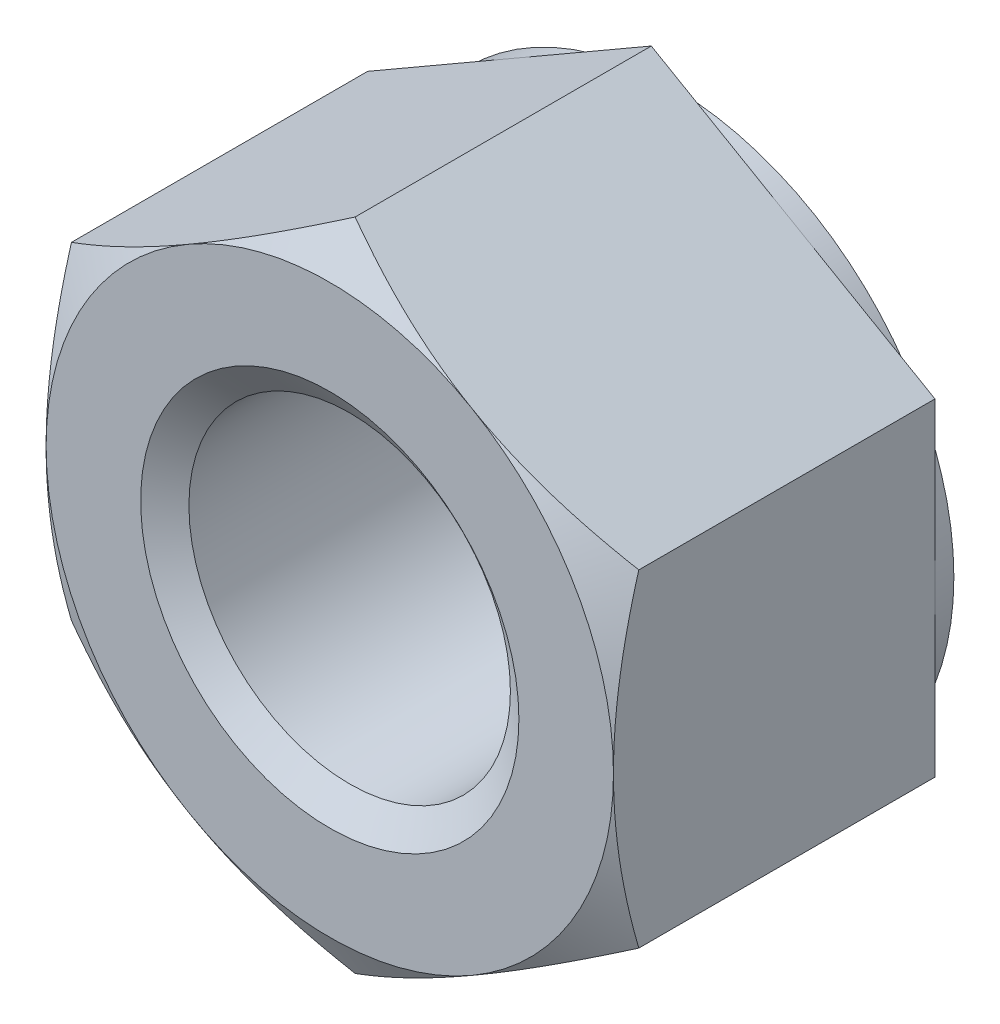
ISO-10303-21;
HEADER;
FILE_DESCRIPTION(('STEP AP214'),'2;1');
FILE_NAME('part.step','',(''),(''),'','','');
FILE_SCHEMA(('AUTOMOTIVE_DESIGN { 1 0 10303 214 1 1 1 1 }'));
ENDSEC;
DATA;
#1=APPLICATION_CONTEXT('core data for automotive mechanical design processes');
#2=APPLICATION_PROTOCOL_DEFINITION('international standard','automotive_design',2000,#1);
#3=PRODUCT_CONTEXT('',#1,'mechanical');
#4=PRODUCT('Part','Part','',(#3));
#5=PRODUCT_RELATED_PRODUCT_CATEGORY('part','',(#4));
#6=PRODUCT_DEFINITION_FORMATION('','',#4);
#7=PRODUCT_DEFINITION_CONTEXT('part definition',#1,'design');
#8=PRODUCT_DEFINITION('design','',#6,#7);
#9=PRODUCT_DEFINITION_SHAPE('','',#8);
#10=(LENGTH_UNIT() NAMED_UNIT(*) SI_UNIT(.MILLI.,.METRE.));
#11=(NAMED_UNIT(*) PLANE_ANGLE_UNIT() SI_UNIT($,.RADIAN.));
#12=(NAMED_UNIT(*) SI_UNIT($,.STERADIAN.) SOLID_ANGLE_UNIT());
#13=UNCERTAINTY_MEASURE_WITH_UNIT(LENGTH_MEASURE(1.E-05),#10,'distance_accuracy_value','');
#14=(GEOMETRIC_REPRESENTATION_CONTEXT(3) GLOBAL_UNCERTAINTY_ASSIGNED_CONTEXT((#13)) GLOBAL_UNIT_ASSIGNED_CONTEXT((#10,
#11,#12)) REPRESENTATION_CONTEXT('',''));
#15=CARTESIAN_POINT('',(0.,0.,0.));
#16=DIRECTION('',(0.,0.,1.));
#17=DIRECTION('',(1.,0.,0.));
#18=AXIS2_PLACEMENT_3D('',#15,#16,#17);
#19=CARTESIAN_POINT('',(0.,0.,-10.8));
#20=DIRECTION('',(0.,0.,1.));
#21=DIRECTION('',(1.,0.,0.));
#22=AXIS2_PLACEMENT_3D('',#19,#20,#21);
#23=CYLINDRICAL_SURFACE('',#22,5.1);
#24=CARTESIAN_POINT('',(0.,0.,-0.630186784388741));
#25=DIRECTION('',(0.,0.,1.));
#26=DIRECTION('',(1.,0.,0.));
#27=AXIS2_PLACEMENT_3D('',#24,#25,#26);
#28=CIRCLE('',#27,5.1);
#29=CARTESIAN_POINT('',(5.1,0.,-0.630186784388741));
#30=VERTEX_POINT('',#29);
#31=EDGE_CURVE('E154',#30,#30,#28,.F.);
#32=CARTESIAN_POINT('',(0.,0.,-10.1444132156113));
#33=DIRECTION('',(0.,0.,-1.));
#34=DIRECTION('',(-1.,0.,0.));
#35=AXIS2_PLACEMENT_3D('',#32,#33,#34);
#36=CIRCLE('',#35,5.1);
#37=CARTESIAN_POINT('',(5.1,0.,-10.1444132156113));
#38=VERTEX_POINT('',#37);
#39=EDGE_CURVE('E42',#38,#38,#36,.F.);
#40=CARTESIAN_POINT('',(5.1,0.,-0.630186784388741));
#41=CARTESIAN_POINT('',(5.1,0.,-0.729293309713976));
#42=CARTESIAN_POINT('',(5.1,0.,-0.82839983503921));
#43=CARTESIAN_POINT('',(5.1,0.,-1.02661288568968));
#44=CARTESIAN_POINT('',(5.1,0.,-1.12571941101491));
#45=CARTESIAN_POINT('',(5.1,0.,-1.32393246166538));
#46=CARTESIAN_POINT('',(5.1,0.,-1.42303898699062));
#47=CARTESIAN_POINT('',(5.1,0.,-1.62125203764109));
#48=CARTESIAN_POINT('',(5.1,0.,-1.72035856296632));
#49=CARTESIAN_POINT('',(5.1,0.,-1.91857161361679));
#50=CARTESIAN_POINT('',(5.1,0.,-2.01767813894202));
#51=CARTESIAN_POINT('',(5.1,0.,-2.21589118959249));
#52=CARTESIAN_POINT('',(5.1,0.,-2.31499771491773));
#53=CARTESIAN_POINT('',(5.1,0.,-2.5132107655682));
#54=CARTESIAN_POINT('',(5.1,0.,-2.61231729089343));
#55=CARTESIAN_POINT('',(5.1,0.,-2.8105303415439));
#56=CARTESIAN_POINT('',(5.1,0.,-2.90963686686914));
#57=CARTESIAN_POINT('',(5.1,0.,-3.1078499175196));
#58=CARTESIAN_POINT('',(5.1,0.,-3.20695644284484));
#59=CARTESIAN_POINT('',(5.1,0.,-3.40516949349531));
#60=CARTESIAN_POINT('',(5.1,0.,-3.50427601882054));
#61=CARTESIAN_POINT('',(5.1,0.,-3.70248906947101));
#62=CARTESIAN_POINT('',(5.1,0.,-3.80159559479625));
#63=CARTESIAN_POINT('',(5.1,0.,-3.99980864544671));
#64=CARTESIAN_POINT('',(5.1,0.,-4.09891517077195));
#65=CARTESIAN_POINT('',(5.1,0.,-4.29712822142242));
#66=CARTESIAN_POINT('',(5.1,0.,-4.39623474674765));
#67=CARTESIAN_POINT('',(5.1,0.,-4.59444779739812));
#68=CARTESIAN_POINT('',(5.1,0.,-4.69355432272336));
#69=CARTESIAN_POINT('',(5.1,0.,-4.89176737337382));
#70=CARTESIAN_POINT('',(5.1,0.,-4.99087389869906));
#71=CARTESIAN_POINT('',(5.1,0.,-5.18908694934953));
#72=CARTESIAN_POINT('',(5.1,0.,-5.28819347467476));
#73=CARTESIAN_POINT('',(5.1,0.,-5.48640652532523));
#74=CARTESIAN_POINT('',(5.1,0.,-5.58551305065047));
#75=CARTESIAN_POINT('',(5.1,0.,-5.78372610130094));
#76=CARTESIAN_POINT('',(5.1,0.,-5.88283262662617));
#77=CARTESIAN_POINT('',(5.1,0.,-6.08104567727664));
#78=CARTESIAN_POINT('',(5.1,0.,-6.18015220260187));
#79=CARTESIAN_POINT('',(5.1,0.,-6.37836525325234));
#80=CARTESIAN_POINT('',(5.1,0.,-6.47747177857758));
#81=CARTESIAN_POINT('',(5.1,0.,-6.67568482922805));
#82=CARTESIAN_POINT('',(5.1,0.,-6.77479135455328));
#83=CARTESIAN_POINT('',(5.1,0.,-6.97300440520375));
#84=CARTESIAN_POINT('',(5.1,0.,-7.07211093052898));
#85=CARTESIAN_POINT('',(5.1,0.,-7.27032398117945));
#86=CARTESIAN_POINT('',(5.1,0.,-7.36943050650469));
#87=CARTESIAN_POINT('',(5.1,0.,-7.56764355715516));
#88=CARTESIAN_POINT('',(5.1,0.,-7.66675008248039));
#89=CARTESIAN_POINT('',(5.1,0.,-7.86496313313086));
#90=CARTESIAN_POINT('',(5.1,0.,-7.96406965845609));
#91=CARTESIAN_POINT('',(5.1,0.,-8.16228270910656));
#92=CARTESIAN_POINT('',(5.1,0.,-8.2613892344318));
#93=CARTESIAN_POINT('',(5.1,0.,-8.45960228508227));
#94=CARTESIAN_POINT('',(5.1,0.,-8.5587088104075));
#95=CARTESIAN_POINT('',(5.1,0.,-8.75692186105797));
#96=CARTESIAN_POINT('',(5.1,0.,-8.8560283863832));
#97=CARTESIAN_POINT('',(5.1,0.,-9.05424143703367));
#98=CARTESIAN_POINT('',(5.1,0.,-9.15334796235891));
#99=CARTESIAN_POINT('',(5.1,0.,-9.35156101300938));
#100=CARTESIAN_POINT('',(5.1,0.,-9.45066753833461));
#101=CARTESIAN_POINT('',(5.1,0.,-9.64888058898508));
#102=CARTESIAN_POINT('',(5.1,0.,-9.74798711431032));
#103=CARTESIAN_POINT('',(5.1,0.,-9.94620016496079));
#104=CARTESIAN_POINT('',(5.1,0.,-10.045306690286));
#105=CARTESIAN_POINT('',(5.1,0.,-10.1444132156113));
#106=B_SPLINE_CURVE_WITH_KNOTS('',3,(#40,#41,#42,#43,#44,#45,#46,#47,#48,#49,#50,#51,#52,#53,
#54,#55,#56,#57,#58,#59,#60,#61,#62,#63,#64,#65,#66,#67,#68,#69,#70,#71,#72,#73,#74,#75,#76,#77,
#78,#79,#80,#81,#82,#83,#84,#85,#86,#87,#88,#89,#90,#91,#92,#93,#94,#95,#96,#97,#98,#99,#100,
#101,#102,#103,#104,#105),.UNSPECIFIED.,.F.,.F.,(4,2,2,2,2,2,2,2,2,2,2,2,2,2,2,2,2,2,2,2,2,2,2,
2,2,2,2,2,2,2,2,2,4),(0.,0.297319575975704,0.594639151951407,0.891958727927111,1.18927830390281,
1.48659787987852,1.78391745585422,2.08123703182993,2.37855660780563,2.67587618378133,
2.97319575975704,3.27051533573274,3.56783491170844,3.86515448768415,4.16247406365985,
4.45979363963555,4.75711321561126,5.05443279158696,5.35175236756266,5.64907194353837,
5.94639151951407,6.24371109548977,6.54103067146548,6.83835024744118,7.13566982341688,
7.43298939939259,7.73030897536829,8.02762855134399,8.3249481273197,8.6222677032954,
8.91958727927111,9.21690685524681,9.51422643122251),.UNSPECIFIED.);
#107=EDGE_CURVE('BSEAM37',#30,#38,#106,.T.);
#108=ORIENTED_EDGE('',*,*,#31,.F.);
#109=ORIENTED_EDGE('',*,*,#39,.F.);
#110=ORIENTED_EDGE('',*,*,#107,.T.);
#111=ORIENTED_EDGE('',*,*,#107,.F.);
#112=EDGE_LOOP('',(#108,#110,#109,#111));
#113=FACE_BOUND('',#112,.T.);
#114=ADVANCED_FACE('F37',(#113),#23,.F.);
#115=CARTESIAN_POINT('',(0.,10.3923048454133,-10.8));
#116=DIRECTION('',(-0.5,0.866025403784439,0.));
#117=DIRECTION('',(-0.866025403784439,-0.5,0.));
#118=AXIS2_PLACEMENT_3D('',#115,#116,#117);
#119=PLANE('',#118);
#120=DIRECTION('',(0.,0.,1.));
#121=VECTOR('',#120,1.);
#122=CARTESIAN_POINT('',(-9.,5.19615242270663,-10.8));
#123=LINE('',#122,#121);
#124=CARTESIAN_POINT('',(-9.,5.19615242270663,-10.2));
#125=VERTEX_POINT('',#124);
#126=CARTESIAN_POINT('',(-9.,5.19615242270663,-0.803847577293374));
#127=VERTEX_POINT('',#126);
#128=EDGE_CURVE('E286',#125,#127,#123,.T.);
#129=ORIENTED_EDGE('',*,*,#128,.T.);
#130=CARTESIAN_POINT('',(-9.0002,5.19603695265279,-0.803914245071137));
#131=CARTESIAN_POINT('',(-8.80239295359878,5.31024090414014,-0.737982001874058));
#132=CARTESIAN_POINT('',(-8.60381439335005,5.42489028935503,-0.675041409210315));
#133=CARTESIAN_POINT('',(-8.20504463395579,5.65512011728599,-0.555968997655539));
#134=CARTESIAN_POINT('',(-8.00485277818155,5.77070093910682,-0.499840117752065));
#135=CARTESIAN_POINT('',(-7.6024849429039,6.00300811711762,-0.395151960728964));
#136=CARTESIAN_POINT('',(-7.4003054074994,6.11973652630804,-0.346610772912787));
#137=CARTESIAN_POINT('',(-6.99457124410925,6.35398725476077,-0.25814851678792));
#138=CARTESIAN_POINT('',(-6.79101690582109,6.47150940676616,-0.218225687483274));
#139=CARTESIAN_POINT('',(-6.38769409169308,6.70436794207328,-0.148684674147114));
#140=CARTESIAN_POINT('',(-6.18795540760099,6.81968712510143,-0.1188375028478));
#141=CARTESIAN_POINT('',(-5.787584324011,7.05084147798785,-0.0687933098590817));
#142=CARTESIAN_POINT('',(-5.58695200505839,7.16667660134328,-0.0485954355375392));
#143=CARTESIAN_POINT('',(-5.18533936402618,7.39854776775319,-0.0183543473973464));
#144=CARTESIAN_POINT('',(-4.98435969733606,7.51458343241837,-0.00829960958430289));
#145=CARTESIAN_POINT('',(-4.58221540008357,7.74676155069016,0.00143766485491798));
#146=CARTESIAN_POINT('',(-4.38105077542777,7.86290400088662,0.00112052193524444));
#147=CARTESIAN_POINT('',(-4.00496738746949,8.08003584616208,-0.00916395215317263));
#148=CARTESIAN_POINT('',(-3.83002210563971,8.18104055171996,-0.0178767400303967));
#149=CARTESIAN_POINT('',(-3.48054132291665,8.38281337570172,-0.0429773400653703));
#150=CARTESIAN_POINT('',(-3.30600585044303,8.48358147771751,-0.0593656695806704));
#151=CARTESIAN_POINT('',(-2.78307512271449,8.7854956741391,-0.119656556235832));
#152=CARTESIAN_POINT('',(-2.43560548489508,8.98610736306936,-0.17467748234113));
#153=CARTESIAN_POINT('',(-1.736980371246,9.38945876049729,-0.312230476325153));
#154=CARTESIAN_POINT('',(-1.38591405631283,9.59214699192737,-0.395345618627111));
#155=CARTESIAN_POINT('',(-0.689016695981394,9.99450087051226,-0.583982539436467));
#156=CARTESIAN_POINT('',(-0.343176726443721,10.1941716700214,-0.689460012893363));
#157=CARTESIAN_POINT('',(0.000199999999999849,10.3924203154671,-0.803914245071137));
#158=B_SPLINE_CURVE_WITH_KNOTS('',3,(#130,#131,#132,#133,#134,#135,#136,#137,#138,#139,#140,
#141,#142,#143,#144,#145,#146,#147,#148,#149,#150,#151,#152,#153,#154,#155,#156,#157),
.UNSPECIFIED.,.F.,.F.,(4,2,2,2,2,2,2,2,2,2,2,2,2,4),(0.,0.713219249102579,1.42674513853509,
2.14194697262263,2.85700253034481,3.55449749123034,4.25193080859215,4.94857085059646,
5.64518936892663,6.25162976378284,6.85811104066341,8.07193747617894,9.31268391793542,
10.5509947443908),.UNSPECIFIED.);
#159=CARTESIAN_POINT('',(-4.5,7.79422863405995,0.));
#160=VERTEX_POINT('',#159);
#161=EDGE_CURVE('E140',#127,#160,#158,.T.);
#162=ORIENTED_EDGE('',*,*,#161,.T.);
#163=CARTESIAN_POINT('',(0.,10.3923048454133,-0.803847577293371));
#164=VERTEX_POINT('',#163);
#165=EDGE_CURVE('E167',#160,#164,#158,.T.);
#166=ORIENTED_EDGE('',*,*,#165,.T.);
#167=DIRECTION('',(0.,0.,1.));
#168=VECTOR('',#167,1.);
#169=CARTESIAN_POINT('',(0.,10.3923048454133,-10.8));
#170=LINE('',#169,#168);
#171=CARTESIAN_POINT('',(0.,10.3923048454133,-10.2));
#172=VERTEX_POINT('',#171);
#173=EDGE_CURVE('E274',#172,#164,#170,.T.);
#174=ORIENTED_EDGE('',*,*,#173,.F.);
#175=DIRECTION('',(-0.866025403784439,-0.5,0.));
#176=VECTOR('',#175,1.);
#177=CARTESIAN_POINT('',(0.,10.3923048454133,-10.2));
#178=LINE('',#177,#176);
#179=CARTESIAN_POINT('',(-4.5,7.79422863405995,-10.2));
#180=VERTEX_POINT('',#179);
#181=EDGE_CURVE('E262',#172,#180,#178,.T.);
#182=ORIENTED_EDGE('',*,*,#181,.T.);
#183=EDGE_CURVE('E258',#180,#125,#178,.T.);
#184=ORIENTED_EDGE('',*,*,#183,.T.);
#185=EDGE_LOOP('',(#129,#162,#166,#174,#182,#184));
#186=FACE_BOUND('',#185,.T.);
#187=ADVANCED_FACE('F39',(#186),#119,.T.);
#188=CARTESIAN_POINT('',(9.,5.19615242270663,-10.8));
#189=DIRECTION('',(0.5,0.866025403784439,0.));
#190=DIRECTION('',(-0.866025403784439,0.5,0.));
#191=AXIS2_PLACEMENT_3D('',#188,#189,#190);
#192=PLANE('',#191);
#193=ORIENTED_EDGE('',*,*,#173,.T.);
#194=CARTESIAN_POINT('',(-0.000200000000000468,10.3924203154671,-0.803914245071137));
#195=CARTESIAN_POINT('',(0.197607046401216,10.2782163639798,-0.737982001874058));
#196=CARTESIAN_POINT('',(0.396185606649945,10.1635669787649,-0.675041409210316));
#197=CARTESIAN_POINT('',(0.79495536604421,9.9333371508339,-0.555968997655538));
#198=CARTESIAN_POINT('',(0.995147221818451,9.81775632901307,-0.499840117752064));
#199=CARTESIAN_POINT('',(1.3975150570961,9.58544915100228,-0.395151960728962));
#200=CARTESIAN_POINT('',(1.5996945925006,9.46872074181186,-0.346610772912786));
#201=CARTESIAN_POINT('',(2.00542875589075,9.23447001335912,-0.258148516787919));
#202=CARTESIAN_POINT('',(2.20898309417891,9.11694786135374,-0.218225687483273));
#203=CARTESIAN_POINT('',(2.61230590830692,8.88408932604661,-0.148684674147113));
#204=CARTESIAN_POINT('',(2.81204459239901,8.76877014301847,-0.118837502847798));
#205=CARTESIAN_POINT('',(3.212415675989,8.53761579013204,-0.0687933098590804));
#206=CARTESIAN_POINT('',(3.41304799494161,8.42178066677661,-0.0485954355375388));
#207=CARTESIAN_POINT('',(3.81466063597382,8.18990950036671,-0.0183543473973463));
#208=CARTESIAN_POINT('',(4.01564030266394,8.07387383570153,-0.00829960958430243));
#209=CARTESIAN_POINT('',(4.41778459991643,7.84169571742973,0.00143766485491902));
#210=CARTESIAN_POINT('',(4.61894922457223,7.72555326723328,0.00112052193524566));
#211=CARTESIAN_POINT('',(4.99503261253051,7.50842142195782,-0.0091639521531718));
#212=CARTESIAN_POINT('',(5.1699778943603,7.40741671639993,-0.0178767400303964));
#213=CARTESIAN_POINT('',(5.51945867708335,7.20564389241818,-0.0429773400653704));
#214=CARTESIAN_POINT('',(5.69399414955697,7.10487579040239,-0.0593656695806703));
#215=CARTESIAN_POINT('',(6.21692487728551,6.8029615939808,-0.119656556235831));
#216=CARTESIAN_POINT('',(6.56439451510492,6.60234990505054,-0.17467748234113));
#217=CARTESIAN_POINT('',(7.263019628754,6.19899850762261,-0.312230476325153));
#218=CARTESIAN_POINT('',(7.61408594368717,5.99631027619253,-0.39534561862711));
#219=CARTESIAN_POINT('',(8.3109833040186,5.59395639760764,-0.583982539436466));
#220=CARTESIAN_POINT('',(8.65682327355628,5.39428559809853,-0.689460012893362));
#221=CARTESIAN_POINT('',(9.0002,5.1960369526528,-0.803914245071137));
#222=B_SPLINE_CURVE_WITH_KNOTS('',3,(#194,#195,#196,#197,#198,#199,#200,#201,#202,#203,#204,
#205,#206,#207,#208,#209,#210,#211,#212,#213,#214,#215,#216,#217,#218,#219,#220,#221),
.UNSPECIFIED.,.F.,.F.,(4,2,2,2,2,2,2,2,2,2,2,2,2,4),(0.,0.713219249102579,1.42674513853509,
2.14194697262263,2.85700253034481,3.55449749123035,4.25193080859215,4.94857085059646,
5.64518936892663,6.25162976378285,6.85811104066341,8.07193747617894,9.31268391793542,
10.5509947443908),.UNSPECIFIED.);
#223=CARTESIAN_POINT('',(4.5,7.79422863405995,0.));
#224=VERTEX_POINT('',#223);
#225=EDGE_CURVE('E163',#164,#224,#222,.T.);
#226=ORIENTED_EDGE('',*,*,#225,.T.);
#227=CARTESIAN_POINT('',(9.,5.19615242270663,-0.803847577293371));
#228=VERTEX_POINT('',#227);
#229=EDGE_CURVE('E149',#224,#228,#222,.T.);
#230=ORIENTED_EDGE('',*,*,#229,.T.);
#231=DIRECTION('',(0.,0.,1.));
#232=VECTOR('',#231,1.);
#233=CARTESIAN_POINT('',(9.,5.19615242270663,-10.8));
#234=LINE('',#233,#232);
#235=CARTESIAN_POINT('',(9.,5.19615242270663,-10.2));
#236=VERTEX_POINT('',#235);
#237=EDGE_CURVE('E162',#236,#228,#234,.T.);
#238=ORIENTED_EDGE('',*,*,#237,.F.);
#239=DIRECTION('',(-0.866025403784439,0.5,0.));
#240=VECTOR('',#239,1.);
#241=CARTESIAN_POINT('',(9.,5.19615242270663,-10.2));
#242=LINE('',#241,#240);
#243=CARTESIAN_POINT('',(4.5,7.79422863405995,-10.2));
#244=VERTEX_POINT('',#243);
#245=EDGE_CURVE('E270',#236,#244,#242,.T.);
#246=ORIENTED_EDGE('',*,*,#245,.T.);
#247=EDGE_CURVE('E266',#244,#172,#242,.T.);
#248=ORIENTED_EDGE('',*,*,#247,.T.);
#249=EDGE_LOOP('',(#193,#226,#230,#238,#246,#248));
#250=FACE_BOUND('',#249,.T.);
#251=ADVANCED_FACE('F234',(#250),#192,.T.);
#252=CARTESIAN_POINT('',(9.,5.19615242270663,-10.8));
#253=DIRECTION('',(-1.,0.,0.));
#254=DIRECTION('',(0.,0.,1.));
#255=AXIS2_PLACEMENT_3D('',#252,#253,#254);
#256=PLANE('',#255);
#257=CARTESIAN_POINT('',(9.,-13.7809619774074,-4.30674034779136));
#258=CARTESIAN_POINT('',(9.,-13.5833938697395,-4.21123885345945));
#259=CARTESIAN_POINT('',(9.,-13.3855869578229,-4.11623162129354));
#260=CARTESIAN_POINT('',(9.,-12.989445086566,-3.92731913537153));
#261=CARTESIAN_POINT('',(9.,-12.7911101214663,-3.83341389369579));
#262=CARTESIAN_POINT('',(9.,-12.1951793772706,-3.55349411537572));
#263=CARTESIAN_POINT('',(9.,-11.796721983269,-3.36930666494445));
#264=CARTESIAN_POINT('',(9.,-10.9947735410802,-3.00593915549481));
#265=CARTESIAN_POINT('',(9.,-10.5912667360483,-2.82679378354545));
#266=CARTESIAN_POINT('',(9.,-9.78093737078392,-2.47619472249472));
#267=CARTESIAN_POINT('',(9.,-9.37411498469579,-2.30474063246144));
#268=CARTESIAN_POINT('',(9.,-8.55145586737857,-1.96953872543292));
#269=CARTESIAN_POINT('',(9.,-8.1355697851272,-1.8059113594896));
#270=CARTESIAN_POINT('',(9.,-7.29889335630537,-1.49147154965799));
#271=CARTESIAN_POINT('',(9.,-6.8781024700067,-1.34066053152139));
#272=CARTESIAN_POINT('',(9.,-6.03180598391543,-1.05590655171687));
#273=CARTESIAN_POINT('',(9.,-5.60631258356863,-0.921927728612016));
#274=CARTESIAN_POINT('',(9.,-4.74929212788305,-0.675187052035351));
#275=CARTESIAN_POINT('',(9.,-4.31776702714833,-0.562418489003211));
#276=CARTESIAN_POINT('',(9.,-3.4483163158746,-0.363581171916829));
#277=CARTESIAN_POINT('',(9.,-3.01038903355476,-0.277519527029016));
#278=CARTESIAN_POINT('',(9.,-2.34964451655233,-0.172766428442975));
#279=CARTESIAN_POINT('',(9.,-2.12872697070445,-0.141903017101593));
#280=CARTESIAN_POINT('',(9.,-1.68585612058643,-0.0888965825450766));
#281=CARTESIAN_POINT('',(9.,-1.46390292105945,-0.066752696008285));
#282=CARTESIAN_POINT('',(9.,-1.02066876581625,-0.0317812327274296));
#283=CARTESIAN_POINT('',(9.,-0.799392393095598,-0.0188958046642679));
#284=CARTESIAN_POINT('',(9.,-0.356492552156374,-0.00250938375947596));
#285=CARTESIAN_POINT('',(9.,-0.134869088482675,0.00099173095085553));
#286=CARTESIAN_POINT('',(9.,0.308263692439242,-0.00147389836518355));
#287=CARTESIAN_POINT('',(9.,0.52977302426634,-0.00743798526342224));
#288=CARTESIAN_POINT('',(9.,0.972347240677047,-0.028685706860041));
#289=CARTESIAN_POINT('',(9.,1.19341210251237,-0.0439698069646569));
#290=CARTESIAN_POINT('',(9.,1.72920526251554,-0.0919895885083706));
#291=CARTESIAN_POINT('',(9.,2.0435219022808,-0.129394929860783));
#292=CARTESIAN_POINT('',(9.,2.66974660245889,-0.220970593115621));
#293=CARTESIAN_POINT('',(9.,2.98165398160701,-0.275145490996258));
#294=CARTESIAN_POINT('',(9.,3.60280284042321,-0.398338856922922));
#295=CARTESIAN_POINT('',(9.,3.91204150992687,-0.467371359657952));
#296=CARTESIAN_POINT('',(9.,4.52733722239783,-0.61817367187314));
#297=CARTESIAN_POINT('',(9.,4.83339456219521,-0.69994228143778));
#298=CARTESIAN_POINT('',(9.,5.44986573988065,-0.876398007872441));
#299=CARTESIAN_POINT('',(9.,5.76020247160963,-0.971352654930081));
#300=CARTESIAN_POINT('',(9.,6.37759566796873,-1.17064401709769));
#301=CARTESIAN_POINT('',(9.,6.68465423393904,-1.27497426101928));
#302=CARTESIAN_POINT('',(9.,7.2942589847594,-1.49086177332452));
#303=CARTESIAN_POINT('',(9.,7.59682084010886,-1.60237505777406));
#304=CARTESIAN_POINT('',(9.,8.19959709040591,-1.83194682144189));
#305=CARTESIAN_POINT('',(9.,8.49981047984931,-1.9500079460046));
#306=CARTESIAN_POINT('',(9.,8.79893322720023,-2.07069526471897));
#307=B_SPLINE_CURVE_WITH_KNOTS('',3,(#257,#258,#259,#260,#261,#262,#263,#264,#265,#266,#267,
#268,#269,#270,#271,#272,#273,#274,#275,#276,#277,#278,#279,#280,#281,#282,#283,#284,#285,#286,
#287,#288,#289,#290,#291,#292,#293,#294,#295,#296,#297,#298,#299,#300,#301,#302,#303,#304,#305,
#306),.UNSPECIFIED.,.F.,.F.,(4,2,2,2,2,2,2,2,2,2,2,2,2,2,2,2,2,2,2,2,2,2,2,2,4),(0.,
0.658317213383773,1.31664163671154,2.63350462236224,3.95790348304861,5.28223322492245,
6.62282162595727,7.96355896575431,9.30138955920959,10.6387962348219,11.9765586125402,
12.6456025923959,13.3145803134253,13.9793407019702,14.644092457611,15.3086576331613,
15.9732559973029,16.9223307168753,17.8716646430283,18.82189928942,19.7720444647979,
20.745479751866,21.7182482442908,22.6855413421191,23.6532281165802),.UNSPECIFIED.);
#308=CARTESIAN_POINT('',(9.,-5.19615242270664,-0.803847577293371));
#309=VERTEX_POINT('',#308);
#310=CARTESIAN_POINT('',(9.,0.,0.));
#311=VERTEX_POINT('',#310);
#312=EDGE_CURVE('E129',#309,#311,#307,.T.);
#313=ORIENTED_EDGE('',*,*,#312,.F.);
#314=DIRECTION('',(0.,0.,1.));
#315=VECTOR('',#314,1.);
#316=CARTESIAN_POINT('',(9.,-5.19615242270663,-10.8));
#317=LINE('',#316,#315);
#318=CARTESIAN_POINT('',(9.,-5.19615242270663,-10.2));
#319=VERTEX_POINT('',#318);
#320=EDGE_CURVE('E279',#319,#309,#317,.T.);
#321=ORIENTED_EDGE('',*,*,#320,.F.);
#322=DIRECTION('',(0.,-1.,0.));
#323=VECTOR('',#322,1.);
#324=CARTESIAN_POINT('',(9.,5.19615242270663,-10.2));
#325=LINE('',#324,#323);
#326=CARTESIAN_POINT('',(9.,0.,-10.2));
#327=VERTEX_POINT('',#326);
#328=EDGE_CURVE('E271',#327,#319,#325,.T.);
#329=ORIENTED_EDGE('',*,*,#328,.F.);
#330=EDGE_CURVE('E273',#236,#327,#325,.T.);
#331=ORIENTED_EDGE('',*,*,#330,.F.);
#332=ORIENTED_EDGE('',*,*,#237,.T.);
#333=EDGE_CURVE('E142',#311,#228,#307,.T.);
#334=ORIENTED_EDGE('',*,*,#333,.F.);
#335=EDGE_LOOP('',(#313,#321,#329,#331,#332,#334));
#336=FACE_BOUND('',#335,.T.);
#337=ADVANCED_FACE('F159',(#336),#256,.F.);
#338=CARTESIAN_POINT('',(0.,-10.3923048454133,-10.8));
#339=DIRECTION('',(0.5,-0.866025403784439,0.));
#340=DIRECTION('',(0.866025403784439,0.5,0.));
#341=AXIS2_PLACEMENT_3D('',#338,#339,#340);
#342=PLANE('',#341);
#343=ORIENTED_EDGE('',*,*,#320,.T.);
#344=CARTESIAN_POINT('',(9.0002,-5.19603695265279,-0.803914245071137));
#345=CARTESIAN_POINT('',(8.80239295359878,-5.31024090414014,-0.737982001874057));
#346=CARTESIAN_POINT('',(8.60381439335005,-5.42489028935503,-0.675041409210315));
#347=CARTESIAN_POINT('',(8.20504463395579,-5.65512011728599,-0.555968997655539));
#348=CARTESIAN_POINT('',(8.00485277818155,-5.77070093910682,-0.499840117752065));
#349=CARTESIAN_POINT('',(7.6024849429039,-6.00300811711762,-0.395151960728963));
#350=CARTESIAN_POINT('',(7.4003054074994,-6.11973652630804,-0.346610772912786));
#351=CARTESIAN_POINT('',(6.99457124410925,-6.35398725476077,-0.258148516787919));
#352=CARTESIAN_POINT('',(6.79101690582109,-6.47150940676616,-0.218225687483273));
#353=CARTESIAN_POINT('',(6.38769409169308,-6.70436794207328,-0.148684674147114));
#354=CARTESIAN_POINT('',(6.18795540760099,-6.81968712510143,-0.118837502847799));
#355=CARTESIAN_POINT('',(5.787584324011,-7.05084147798785,-0.0687933098590805));
#356=CARTESIAN_POINT('',(5.58695200505839,-7.16667660134328,-0.0485954355375381));
#357=CARTESIAN_POINT('',(5.18533936402618,-7.39854776775319,-0.0183543473973455));
#358=CARTESIAN_POINT('',(4.98435969733606,-7.51458343241837,-0.00829960958430208));
#359=CARTESIAN_POINT('',(4.58221540008357,-7.74676155069016,0.00143766485491866));
#360=CARTESIAN_POINT('',(4.38105077542777,-7.86290400088662,0.00112052193524514));
#361=CARTESIAN_POINT('',(4.00496738746949,-8.08003584616208,-0.00916395215317183));
#362=CARTESIAN_POINT('',(3.83002210563971,-8.18104055171996,-0.0178767400303959));
#363=CARTESIAN_POINT('',(3.48054132291665,-8.38281337570172,-0.0429773400653694));
#364=CARTESIAN_POINT('',(3.30600585044303,-8.48358147771751,-0.0593656695806696));
#365=CARTESIAN_POINT('',(2.78307512271449,-8.7854956741391,-0.119656556235831));
#366=CARTESIAN_POINT('',(2.43560548489508,-8.98610736306936,-0.17467748234113));
#367=CARTESIAN_POINT('',(1.736980371246,-9.38945876049729,-0.312230476325153));
#368=CARTESIAN_POINT('',(1.38591405631283,-9.59214699192737,-0.39534561862711));
#369=CARTESIAN_POINT('',(0.689016695981394,-9.99450087051226,-0.583982539436467));
#370=CARTESIAN_POINT('',(0.34317672644372,-10.1941716700214,-0.689460012893363));
#371=CARTESIAN_POINT('',(-0.000199999999999197,-10.3924203154671,-0.803914245071136));
#372=B_SPLINE_CURVE_WITH_KNOTS('',3,(#344,#345,#346,#347,#348,#349,#350,#351,#352,#353,#354,
#355,#356,#357,#358,#359,#360,#361,#362,#363,#364,#365,#366,#367,#368,#369,#370,#371),
.UNSPECIFIED.,.F.,.F.,(4,2,2,2,2,2,2,2,2,2,2,2,2,4),(0.,0.713219249102579,1.42674513853509,
2.14194697262263,2.85700253034481,3.55449749123034,4.25193080859215,4.94857085059646,
5.64518936892663,6.25162976378284,6.85811104066341,8.07193747617894,9.31268391793542,
10.5509947443908),.UNSPECIFIED.);
#373=CARTESIAN_POINT('',(4.5,-7.79422863405995,0.));
#374=VERTEX_POINT('',#373);
#375=EDGE_CURVE('E135',#309,#374,#372,.T.);
#376=ORIENTED_EDGE('',*,*,#375,.T.);
#377=CARTESIAN_POINT('',(0.,-10.3923048454133,-0.803847577293371));
#378=VERTEX_POINT('',#377);
#379=EDGE_CURVE('E56',#374,#378,#372,.T.);
#380=ORIENTED_EDGE('',*,*,#379,.T.);
#381=DIRECTION('',(0.,0.,1.));
#382=VECTOR('',#381,1.);
#383=CARTESIAN_POINT('',(0.,-10.3923048454133,-10.8));
#384=LINE('',#383,#382);
#385=CARTESIAN_POINT('',(0.,-10.3923048454133,-10.2));
#386=VERTEX_POINT('',#385);
#387=EDGE_CURVE('E281',#386,#378,#384,.T.);
#388=ORIENTED_EDGE('',*,*,#387,.F.);
#389=DIRECTION('',(0.866025403784439,0.5,0.));
#390=VECTOR('',#389,1.);
#391=CARTESIAN_POINT('',(0.,-10.3923048454133,-10.2));
#392=LINE('',#391,#390);
#393=CARTESIAN_POINT('',(4.5,-7.79422863405995,-10.2));
#394=VERTEX_POINT('',#393);
#395=EDGE_CURVE('E263',#386,#394,#392,.T.);
#396=ORIENTED_EDGE('',*,*,#395,.T.);
#397=EDGE_CURVE('E267',#394,#319,#392,.T.);
#398=ORIENTED_EDGE('',*,*,#397,.T.);
#399=EDGE_LOOP('',(#343,#376,#380,#388,#396,#398));
#400=FACE_BOUND('',#399,.T.);
#401=ADVANCED_FACE('F215',(#400),#342,.T.);
#402=CARTESIAN_POINT('',(-9.,-5.19615242270663,-10.8));
#403=DIRECTION('',(-0.5,-0.866025403784439,0.));
#404=DIRECTION('',(0.866025403784439,-0.5,0.));
#405=AXIS2_PLACEMENT_3D('',#402,#403,#404);
#406=PLANE('',#405);
#407=ORIENTED_EDGE('',*,*,#387,.T.);
#408=CARTESIAN_POINT('',(0.000199999999999553,-10.3924203154671,-0.803914245071136));
#409=CARTESIAN_POINT('',(-0.197607046401217,-10.2782163639798,-0.737982001874058));
#410=CARTESIAN_POINT('',(-0.396185606649945,-10.1635669787649,-0.675041409210315));
#411=CARTESIAN_POINT('',(-0.79495536604421,-9.9333371508339,-0.555968997655538));
#412=CARTESIAN_POINT('',(-0.995147221818451,-9.81775632901307,-0.499840117752063));
#413=CARTESIAN_POINT('',(-1.3975150570961,-9.58544915100227,-0.395151960728962));
#414=CARTESIAN_POINT('',(-1.5996945925006,-9.46872074181185,-0.346610772912785));
#415=CARTESIAN_POINT('',(-2.00542875589075,-9.23447001335912,-0.258148516787919));
#416=CARTESIAN_POINT('',(-2.20898309417891,-9.11694786135373,-0.218225687483272));
#417=CARTESIAN_POINT('',(-2.61230590830692,-8.88408932604661,-0.148684674147113));
#418=CARTESIAN_POINT('',(-2.81204459239901,-8.76877014301847,-0.118837502847798));
#419=CARTESIAN_POINT('',(-3.212415675989,-8.53761579013204,-0.06879330985908));
#420=CARTESIAN_POINT('',(-3.41304799494161,-8.42178066677661,-0.048595435537538));
#421=CARTESIAN_POINT('',(-3.81466063597382,-8.18990950036671,-0.0183543473973451));
#422=CARTESIAN_POINT('',(-4.01564030266394,-8.07387383570153,-0.00829960958430133));
#423=CARTESIAN_POINT('',(-4.41778459991643,-7.84169571742973,0.00143766485491942));
#424=CARTESIAN_POINT('',(-4.61894922457223,-7.72555326723327,0.00112052193524544));
#425=CARTESIAN_POINT('',(-4.99503261253051,-7.50842142195781,-0.00916395215317161));
#426=CARTESIAN_POINT('',(-5.16997789436029,-7.40741671639993,-0.0178767400303954));
#427=CARTESIAN_POINT('',(-5.51945867708335,-7.20564389241817,-0.0429773400653689));
#428=CARTESIAN_POINT('',(-5.69399414955697,-7.10487579040239,-0.0593656695806694));
#429=CARTESIAN_POINT('',(-6.21692487728551,-6.8029615939808,-0.119656556235831));
#430=CARTESIAN_POINT('',(-6.56439451510492,-6.60234990505054,-0.17467748234113));
#431=CARTESIAN_POINT('',(-7.263019628754,-6.1989985076226,-0.312230476325153));
#432=CARTESIAN_POINT('',(-7.61408594368717,-5.99631027619253,-0.395345618627109));
#433=CARTESIAN_POINT('',(-8.3109833040186,-5.59395639760764,-0.583982539436464));
#434=CARTESIAN_POINT('',(-8.65682327355628,-5.39428559809853,-0.68946001289336));
#435=CARTESIAN_POINT('',(-9.0002,-5.19603695265279,-0.803914245071136));
#436=B_SPLINE_CURVE_WITH_KNOTS('',3,(#408,#409,#410,#411,#412,#413,#414,#415,#416,#417,#418,
#419,#420,#421,#422,#423,#424,#425,#426,#427,#428,#429,#430,#431,#432,#433,#434,#435),
.UNSPECIFIED.,.F.,.F.,(4,2,2,2,2,2,2,2,2,2,2,2,2,4),(0.,0.713219249102578,1.42674513853509,
2.14194697262263,2.85700253034481,3.55449749123034,4.25193080859215,4.94857085059646,
5.64518936892663,6.25162976378284,6.85811104066341,8.07193747617894,9.31268391793542,
10.5509947443908),.UNSPECIFIED.);
#437=CARTESIAN_POINT('',(-4.5,-7.79422863405995,0.));
#438=VERTEX_POINT('',#437);
#439=EDGE_CURVE('E209',#378,#438,#436,.T.);
#440=ORIENTED_EDGE('',*,*,#439,.T.);
#441=CARTESIAN_POINT('',(-9.,-5.19615242270663,-0.803847577293371));
#442=VERTEX_POINT('',#441);
#443=EDGE_CURVE('E63',#438,#442,#436,.T.);
#444=ORIENTED_EDGE('',*,*,#443,.T.);
#445=DIRECTION('',(0.,0.,1.));
#446=VECTOR('',#445,1.);
#447=CARTESIAN_POINT('',(-9.,-5.19615242270663,-10.8));
#448=LINE('',#447,#446);
#449=CARTESIAN_POINT('',(-9.,-5.19615242270663,-10.2));
#450=VERTEX_POINT('',#449);
#451=EDGE_CURVE('E284',#450,#442,#448,.T.);
#452=ORIENTED_EDGE('',*,*,#451,.F.);
#453=DIRECTION('',(0.866025403784439,-0.5,0.));
#454=VECTOR('',#453,1.);
#455=CARTESIAN_POINT('',(-9.,-5.19615242270663,-10.2));
#456=LINE('',#455,#454);
#457=CARTESIAN_POINT('',(-4.5,-7.79422863405995,-10.2));
#458=VERTEX_POINT('',#457);
#459=EDGE_CURVE('E253',#450,#458,#456,.T.);
#460=ORIENTED_EDGE('',*,*,#459,.T.);
#461=EDGE_CURVE('E259',#458,#386,#456,.T.);
#462=ORIENTED_EDGE('',*,*,#461,.T.);
#463=EDGE_LOOP('',(#407,#440,#444,#452,#460,#462));
#464=FACE_BOUND('',#463,.T.);
#465=ADVANCED_FACE('F211',(#464),#406,.T.);
#466=CARTESIAN_POINT('',(-9.,5.19615242270663,-10.8));
#467=DIRECTION('',(-1.,0.,0.));
#468=DIRECTION('',(0.,0.,1.));
#469=AXIS2_PLACEMENT_3D('',#466,#467,#468);
#470=PLANE('',#469);
#471=ORIENTED_EDGE('',*,*,#451,.T.);
#472=CARTESIAN_POINT('',(-9.,-13.7809619774074,-4.30674034779136));
#473=CARTESIAN_POINT('',(-9.,-13.5833938697395,-4.21123885345945));
#474=CARTESIAN_POINT('',(-9.,-13.3855869578229,-4.11623162129354));
#475=CARTESIAN_POINT('',(-9.,-12.989445086566,-3.92731913537153));
#476=CARTESIAN_POINT('',(-9.,-12.7911101214663,-3.83341389369579));
#477=CARTESIAN_POINT('',(-9.,-12.1951793772706,-3.55349411537572));
#478=CARTESIAN_POINT('',(-9.,-11.796721983269,-3.36930666494445));
#479=CARTESIAN_POINT('',(-9.,-10.9947735410802,-3.00593915549481));
#480=CARTESIAN_POINT('',(-9.,-10.5912667360483,-2.82679378354545));
#481=CARTESIAN_POINT('',(-9.,-9.78093737078392,-2.47619472249472));
#482=CARTESIAN_POINT('',(-9.,-9.37411498469579,-2.30474063246144));
#483=CARTESIAN_POINT('',(-9.,-8.55145586737857,-1.96953872543292));
#484=CARTESIAN_POINT('',(-9.,-8.1355697851272,-1.8059113594896));
#485=CARTESIAN_POINT('',(-9.,-7.29889335630537,-1.49147154965799));
#486=CARTESIAN_POINT('',(-9.,-6.8781024700067,-1.34066053152139));
#487=CARTESIAN_POINT('',(-9.,-6.03180598391543,-1.05590655171687));
#488=CARTESIAN_POINT('',(-9.,-5.60631258356863,-0.921927728612016));
#489=CARTESIAN_POINT('',(-9.,-4.74929212788305,-0.675187052035351));
#490=CARTESIAN_POINT('',(-9.,-4.31776702714833,-0.562418489003211));
#491=CARTESIAN_POINT('',(-9.,-3.4483163158746,-0.363581171916829));
#492=CARTESIAN_POINT('',(-9.,-3.01038903355476,-0.277519527029016));
#493=CARTESIAN_POINT('',(-9.,-2.34964451655233,-0.172766428442975));
#494=CARTESIAN_POINT('',(-9.,-2.12872697070445,-0.141903017101593));
#495=CARTESIAN_POINT('',(-9.,-1.68585612058643,-0.0888965825450766));
#496=CARTESIAN_POINT('',(-9.,-1.46390292105945,-0.066752696008285));
#497=CARTESIAN_POINT('',(-9.,-1.02066876581625,-0.0317812327274296));
#498=CARTESIAN_POINT('',(-9.,-0.799392393095598,-0.0188958046642679));
#499=CARTESIAN_POINT('',(-9.,-0.356492552156374,-0.00250938375947596));
#500=CARTESIAN_POINT('',(-9.,-0.134869088482675,0.00099173095085553));
#501=CARTESIAN_POINT('',(-9.,0.308263692439242,-0.00147389836518355));
#502=CARTESIAN_POINT('',(-9.,0.52977302426634,-0.00743798526342224));
#503=CARTESIAN_POINT('',(-9.,0.972347240677047,-0.028685706860041));
#504=CARTESIAN_POINT('',(-9.,1.19341210251237,-0.0439698069646569));
#505=CARTESIAN_POINT('',(-9.,1.72920526251554,-0.0919895885083706));
#506=CARTESIAN_POINT('',(-9.,2.0435219022808,-0.129394929860783));
#507=CARTESIAN_POINT('',(-9.,2.66974660245889,-0.220970593115621));
#508=CARTESIAN_POINT('',(-9.,2.98165398160701,-0.275145490996258));
#509=CARTESIAN_POINT('',(-9.,3.60280284042321,-0.398338856922922));
#510=CARTESIAN_POINT('',(-9.,3.91204150992687,-0.467371359657952));
#511=CARTESIAN_POINT('',(-9.,4.52733722239783,-0.61817367187314));
#512=CARTESIAN_POINT('',(-9.,4.83339456219521,-0.69994228143778));
#513=CARTESIAN_POINT('',(-9.,5.44986573988065,-0.876398007872441));
#514=CARTESIAN_POINT('',(-9.,5.76020247160963,-0.971352654930081));
#515=CARTESIAN_POINT('',(-9.,6.37759566796873,-1.17064401709769));
#516=CARTESIAN_POINT('',(-9.,6.68465423393904,-1.27497426101928));
#517=CARTESIAN_POINT('',(-9.,7.2942589847594,-1.49086177332452));
#518=CARTESIAN_POINT('',(-9.,7.59682084010886,-1.60237505777406));
#519=CARTESIAN_POINT('',(-9.,8.19959709040591,-1.83194682144189));
#520=CARTESIAN_POINT('',(-9.,8.49981047984931,-1.9500079460046));
#521=CARTESIAN_POINT('',(-9.,8.79893322720023,-2.07069526471897));
#522=B_SPLINE_CURVE_WITH_KNOTS('',3,(#472,#473,#474,#475,#476,#477,#478,#479,#480,#481,#482,
#483,#484,#485,#486,#487,#488,#489,#490,#491,#492,#493,#494,#495,#496,#497,#498,#499,#500,#501,
#502,#503,#504,#505,#506,#507,#508,#509,#510,#511,#512,#513,#514,#515,#516,#517,#518,#519,#520,
#521),.UNSPECIFIED.,.F.,.F.,(4,2,2,2,2,2,2,2,2,2,2,2,2,2,2,2,2,2,2,2,2,2,2,2,4),(0.,
0.658317213383773,1.31664163671154,2.63350462236224,3.95790348304861,5.28223322492245,
6.62282162595727,7.96355896575431,9.30138955920959,10.6387962348219,11.9765586125402,
12.6456025923959,13.3145803134253,13.9793407019702,14.644092457611,15.3086576331613,
15.9732559973029,16.9223307168753,17.8716646430283,18.82189928942,19.7720444647979,
20.745479751866,21.7182482442908,22.6855413421191,23.6532281165802),.UNSPECIFIED.);
#523=CARTESIAN_POINT('',(-9.,0.,0.));
#524=VERTEX_POINT('',#523);
#525=EDGE_CURVE('E210',#442,#524,#522,.T.);
#526=ORIENTED_EDGE('',*,*,#525,.T.);
#527=EDGE_CURVE('E153',#524,#127,#522,.T.);
#528=ORIENTED_EDGE('',*,*,#527,.T.);
#529=ORIENTED_EDGE('',*,*,#128,.F.);
#530=DIRECTION('',(0.,-1.,0.));
#531=VECTOR('',#530,1.);
#532=CARTESIAN_POINT('',(-9.,5.19615242270663,-10.2));
#533=LINE('',#532,#531);
#534=CARTESIAN_POINT('',(-9.,0.,-10.2));
#535=VERTEX_POINT('',#534);
#536=EDGE_CURVE('E293',#125,#535,#533,.T.);
#537=ORIENTED_EDGE('',*,*,#536,.T.);
#538=EDGE_CURVE('E291',#535,#450,#533,.T.);
#539=ORIENTED_EDGE('',*,*,#538,.T.);
#540=EDGE_LOOP('',(#471,#526,#528,#529,#537,#539));
#541=FACE_BOUND('',#540,.T.);
#542=ADVANCED_FACE('F214',(#541),#470,.T.);
#543=CARTESIAN_POINT('',(-9.,5.19615242270663,0.));
#544=DIRECTION('',(0.,0.,1.));
#545=DIRECTION('',(1.,0.,0.));
#546=AXIS2_PLACEMENT_3D('',#543,#544,#545);
#547=PLANE('',#546);
#548=CARTESIAN_POINT('',(0.,0.,0.));
#549=DIRECTION('',(0.,0.,1.));
#550=DIRECTION('',(1.,0.,0.));
#551=AXIS2_PLACEMENT_3D('',#548,#549,#550);
#552=CIRCLE('',#551,6.);
#553=CARTESIAN_POINT('',(6.,0.,0.));
#554=VERTEX_POINT('',#553);
#555=EDGE_CURVE('E296',#554,#554,#552,.T.);
#556=ORIENTED_EDGE('',*,*,#555,.F.);
#557=EDGE_LOOP('',(#556));
#558=FACE_BOUND('',#557,.T.);
#559=CARTESIAN_POINT('',(0.,0.,0.));
#560=DIRECTION('',(0.,0.,1.));
#561=DIRECTION('',(1.,0.,0.));
#562=AXIS2_PLACEMENT_3D('',#559,#560,#561);
#563=CIRCLE('',#562,9.);
#564=EDGE_CURVE('E12',#311,#374,#563,.F.);
#565=ORIENTED_EDGE('',*,*,#564,.F.);
#566=CARTESIAN_POINT('',(0.,0.,0.));
#567=DIRECTION('',(0.,0.,1.));
#568=DIRECTION('',(1.,0.,0.));
#569=AXIS2_PLACEMENT_3D('',#566,#567,#568);
#570=CIRCLE('',#569,9.);
#571=EDGE_CURVE('E146',#311,#224,#570,.T.);
#572=ORIENTED_EDGE('',*,*,#571,.T.);
#573=EDGE_CURVE('E49',#160,#224,#563,.F.);
#574=ORIENTED_EDGE('',*,*,#573,.F.);
#575=EDGE_CURVE('E361',#524,#160,#563,.F.);
#576=ORIENTED_EDGE('',*,*,#575,.F.);
#577=EDGE_CURVE('E363',#438,#524,#563,.F.);
#578=ORIENTED_EDGE('',*,*,#577,.F.);
#579=EDGE_CURVE('E47',#374,#438,#563,.F.);
#580=ORIENTED_EDGE('',*,*,#579,.F.);
#581=EDGE_LOOP('',(#565,#572,#574,#576,#578,#580));
#582=FACE_BOUND('',#581,.T.);
#583=ADVANCED_FACE('F156',(#558,#582),#547,.T.);
#584=CARTESIAN_POINT('',(-9.,5.19615242270663,-10.8));
#585=DIRECTION('',(0.,0.,1.));
#586=DIRECTION('',(1.,0.,0.));
#587=AXIS2_PLACEMENT_3D('',#584,#585,#586);
#588=PLANE('',#587);
#589=CARTESIAN_POINT('',(0.,0.,-10.8));
#590=DIRECTION('',(0.,0.,1.));
#591=DIRECTION('',(1.,0.,0.));
#592=AXIS2_PLACEMENT_3D('',#589,#590,#591);
#593=CIRCLE('',#592,6.);
#594=CARTESIAN_POINT('',(6.,0.,-10.8));
#595=VERTEX_POINT('',#594);
#596=EDGE_CURVE('E297',#595,#595,#593,.F.);
#597=ORIENTED_EDGE('',*,*,#596,.F.);
#598=EDGE_LOOP('',(#597));
#599=FACE_BOUND('',#598,.T.);
#600=CARTESIAN_POINT('',(0.,0.,-10.8));
#601=DIRECTION('',(0.,0.,1.));
#602=DIRECTION('',(1.,0.,0.));
#603=AXIS2_PLACEMENT_3D('',#600,#601,#602);
#604=CIRCLE('',#603,9.);
#605=CARTESIAN_POINT('',(9.,0.,-10.8));
#606=VERTEX_POINT('',#605);
#607=EDGE_CURVE('E277',#606,#606,#604,.F.);
#608=ORIENTED_EDGE('',*,*,#607,.T.);
#609=EDGE_LOOP('',(#608));
#610=FACE_BOUND('',#609,.T.);
#611=ADVANCED_FACE('F224',(#599,#610),#588,.F.);
#612=CARTESIAN_POINT('',(0.,20.3923048454133,-10.2));
#613=DIRECTION('',(0.,0.,-1.));
#614=DIRECTION('',(-1.,0.,0.));
#615=AXIS2_PLACEMENT_3D('',#612,#613,#614);
#616=PLANE('',#615);
#617=ORIENTED_EDGE('',*,*,#330,.T.);
#618=CARTESIAN_POINT('',(0.,0.,-10.2));
#619=DIRECTION('',(0.,0.,1.));
#620=DIRECTION('',(1.,0.,0.));
#621=AXIS2_PLACEMENT_3D('',#618,#619,#620);
#622=CIRCLE('',#621,9.);
#623=EDGE_CURVE('E250',#327,#244,#622,.T.);
#624=ORIENTED_EDGE('',*,*,#623,.T.);
#625=ORIENTED_EDGE('',*,*,#245,.F.);
#626=EDGE_LOOP('',(#617,#624,#625));
#627=FACE_BOUND('',#626,.T.);
#628=ADVANCED_FACE('F241',(#627),#616,.T.);
#629=ORIENTED_EDGE('',*,*,#328,.T.);
#630=ORIENTED_EDGE('',*,*,#397,.F.);
#631=EDGE_CURVE('E255',#394,#327,#622,.T.);
#632=ORIENTED_EDGE('',*,*,#631,.T.);
#633=EDGE_LOOP('',(#629,#630,#632));
#634=FACE_BOUND('',#633,.T.);
#635=ADVANCED_FACE('F339',(#634),#616,.T.);
#636=EDGE_CURVE('E254',#244,#180,#622,.T.);
#637=ORIENTED_EDGE('',*,*,#636,.T.);
#638=ORIENTED_EDGE('',*,*,#181,.F.);
#639=ORIENTED_EDGE('',*,*,#247,.F.);
#640=EDGE_LOOP('',(#637,#638,#639));
#641=FACE_BOUND('',#640,.T.);
#642=ADVANCED_FACE('F347',(#641),#616,.T.);
#643=ORIENTED_EDGE('',*,*,#461,.F.);
#644=EDGE_CURVE('E378',#458,#394,#622,.T.);
#645=ORIENTED_EDGE('',*,*,#644,.T.);
#646=ORIENTED_EDGE('',*,*,#395,.F.);
#647=EDGE_LOOP('',(#643,#645,#646));
#648=FACE_BOUND('',#647,.T.);
#649=ADVANCED_FACE('F342',(#648),#616,.T.);
#650=EDGE_CURVE('E351',#180,#535,#622,.T.);
#651=ORIENTED_EDGE('',*,*,#650,.T.);
#652=ORIENTED_EDGE('',*,*,#536,.F.);
#653=ORIENTED_EDGE('',*,*,#183,.F.);
#654=EDGE_LOOP('',(#651,#652,#653));
#655=FACE_BOUND('',#654,.T.);
#656=ADVANCED_FACE('F333',(#655),#616,.T.);
#657=CARTESIAN_POINT('',(0.,0.,0.));
#658=DIRECTION('',(0.,0.,1.));
#659=DIRECTION('',(1.,0.,0.));
#660=AXIS2_PLACEMENT_3D('',#657,#658,#659);
#661=CYLINDRICAL_SURFACE('',#660,9.);
#662=ORIENTED_EDGE('',*,*,#607,.F.);
#663=EDGE_LOOP('',(#662));
#664=FACE_BOUND('',#663,.T.);
#665=ORIENTED_EDGE('',*,*,#636,.F.);
#666=ORIENTED_EDGE('',*,*,#623,.F.);
#667=ORIENTED_EDGE('',*,*,#631,.F.);
#668=ORIENTED_EDGE('',*,*,#644,.F.);
#669=EDGE_CURVE('E357',#535,#458,#622,.T.);
#670=ORIENTED_EDGE('',*,*,#669,.F.);
#671=ORIENTED_EDGE('',*,*,#650,.F.);
#672=EDGE_LOOP('',(#665,#666,#667,#668,#670,#671));
#673=FACE_BOUND('',#672,.T.);
#674=ADVANCED_FACE('F194',(#664,#673),#661,.T.);
#675=ORIENTED_EDGE('',*,*,#538,.F.);
#676=ORIENTED_EDGE('',*,*,#669,.T.);
#677=ORIENTED_EDGE('',*,*,#459,.F.);
#678=EDGE_LOOP('',(#675,#676,#677));
#679=FACE_BOUND('',#678,.T.);
#680=ADVANCED_FACE('F239',(#679),#616,.T.);
#681=CARTESIAN_POINT('',(0.,0.,0.));
#682=DIRECTION('',(0.,0.,-1.));
#683=DIRECTION('',(-1.,0.,0.));
#684=AXIS2_PLACEMENT_3D('',#681,#682,#683);
#685=CONICAL_SURFACE('',#684,9.,1.0471975511966);
#686=ORIENTED_EDGE('',*,*,#571,.F.);
#687=ORIENTED_EDGE('',*,*,#333,.T.);
#688=ORIENTED_EDGE('',*,*,#229,.F.);
#689=EDGE_LOOP('',(#686,#687,#688));
#690=FACE_BOUND('',#689,.T.);
#691=ADVANCED_FACE('F147',(#690),#685,.T.);
#692=ORIENTED_EDGE('',*,*,#573,.T.);
#693=ORIENTED_EDGE('',*,*,#225,.F.);
#694=ORIENTED_EDGE('',*,*,#165,.F.);
#695=EDGE_LOOP('',(#692,#693,#694));
#696=FACE_BOUND('',#695,.T.);
#697=ADVANCED_FACE('F191',(#696),#685,.T.);
#698=ORIENTED_EDGE('',*,*,#527,.F.);
#699=ORIENTED_EDGE('',*,*,#575,.T.);
#700=ORIENTED_EDGE('',*,*,#161,.F.);
#701=EDGE_LOOP('',(#698,#699,#700));
#702=FACE_BOUND('',#701,.T.);
#703=ADVANCED_FACE('F190',(#702),#685,.T.);
#704=ORIENTED_EDGE('',*,*,#577,.T.);
#705=ORIENTED_EDGE('',*,*,#525,.F.);
#706=ORIENTED_EDGE('',*,*,#443,.F.);
#707=EDGE_LOOP('',(#704,#705,#706));
#708=FACE_BOUND('',#707,.T.);
#709=ADVANCED_FACE('F184',(#708),#685,.T.);
#710=ORIENTED_EDGE('',*,*,#579,.T.);
#711=ORIENTED_EDGE('',*,*,#439,.F.);
#712=ORIENTED_EDGE('',*,*,#379,.F.);
#713=EDGE_LOOP('',(#710,#711,#712));
#714=FACE_BOUND('',#713,.T.);
#715=ADVANCED_FACE('F189',(#714),#685,.T.);
#716=ORIENTED_EDGE('',*,*,#312,.T.);
#717=ORIENTED_EDGE('',*,*,#564,.T.);
#718=ORIENTED_EDGE('',*,*,#375,.F.);
#719=EDGE_LOOP('',(#716,#717,#718));
#720=FACE_BOUND('',#719,.T.);
#721=ADVANCED_FACE('F131',(#720),#685,.T.);
#722=CARTESIAN_POINT('',(0.,0.,-0.693205462827615));
#723=DIRECTION('',(0.,0.,1.));
#724=DIRECTION('',(1.,0.,0.));
#725=AXIS2_PLACEMENT_3D('',#722,#723,#724);
#726=CONICAL_SURFACE('',#725,5.01,0.95993108859688);
#727=ORIENTED_EDGE('',*,*,#555,.T.);
#728=EDGE_LOOP('',(#727));
#729=FACE_BOUND('',#728,.T.);
#730=ORIENTED_EDGE('',*,*,#31,.T.);
#731=EDGE_LOOP('',(#730));
#732=FACE_BOUND('',#731,.T.);
#733=ADVANCED_FACE('F192',(#729,#732),#726,.F.);
#734=CARTESIAN_POINT('',(0.,0.,-10.7746));
#735=DIRECTION('',(0.,0.,-1.));
#736=DIRECTION('',(-1.,0.,0.));
#737=AXIS2_PLACEMENT_3D('',#734,#735,#736);
#738=CONICAL_SURFACE('',#737,6.,0.95993108859688);
#739=CARTESIAN_POINT('',(0.,0.,-10.7746));
#740=DIRECTION('',(0.,0.,1.));
#741=DIRECTION('',(1.,0.,0.));
#742=AXIS2_PLACEMENT_3D('',#739,#740,#741);
#743=CIRCLE('',#742,6.);
#744=CARTESIAN_POINT('',(6.,0.,-10.7746));
#745=VERTEX_POINT('',#744);
#746=EDGE_CURVE('E299',#745,#745,#743,.T.);
#747=ORIENTED_EDGE('',*,*,#746,.F.);
#748=EDGE_LOOP('',(#747));
#749=FACE_BOUND('',#748,.T.);
#750=ORIENTED_EDGE('',*,*,#39,.T.);
#751=EDGE_LOOP('',(#750));
#752=FACE_BOUND('',#751,.T.);
#753=ADVANCED_FACE('F313',(#749,#752),#738,.F.);
#754=CARTESIAN_POINT('',(0.,0.,-25.0375057290932));
#755=DIRECTION('',(0.,0.,1.));
#756=DIRECTION('',(1.,0.,0.));
#757=AXIS2_PLACEMENT_3D('',#754,#755,#756);
#758=CYLINDRICAL_SURFACE('',#757,6.);
#759=ORIENTED_EDGE('',*,*,#746,.T.);
#760=EDGE_LOOP('',(#759));
#761=FACE_BOUND('',#760,.T.);
#762=ORIENTED_EDGE('',*,*,#596,.T.);
#763=EDGE_LOOP('',(#762));
#764=FACE_BOUND('',#763,.T.);
#765=ADVANCED_FACE('F318',(#761,#764),#758,.F.);
#766=CLOSED_SHELL('',(#114,#187,#251,#337,#401,#465,#542,#583,#611,#628,#635,#642,#649,#656,
#674,#680,#691,#697,#703,#709,#715,#721,#733,#753,#765));
#767=MANIFOLD_SOLID_BREP('B2',#766);
#768=ADVANCED_BREP_SHAPE_REPRESENTATION('',(#18,#767),#14);
#769=SHAPE_DEFINITION_REPRESENTATION(#9,#768);
ENDSEC;
END-ISO-10303-21;
